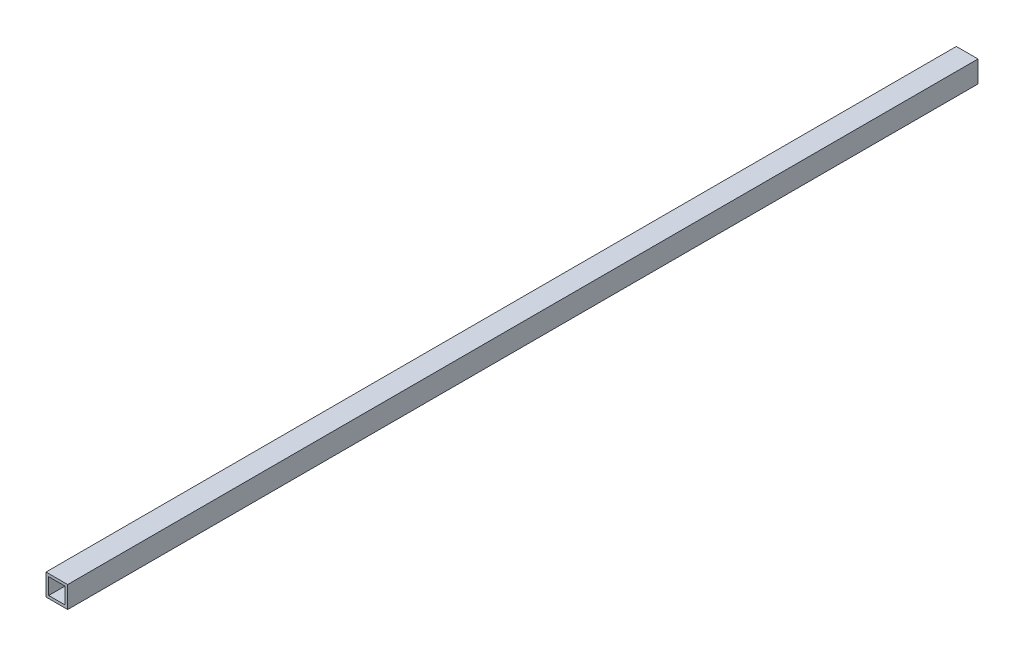
ISO-10303-21;
HEADER;
FILE_DESCRIPTION(('STEP AP214'),'2;1');
FILE_NAME('part.step','',(''),(''),'','','');
FILE_SCHEMA(('AUTOMOTIVE_DESIGN { 1 0 10303 214 1 1 1 1 }'));
ENDSEC;
DATA;
#1=APPLICATION_CONTEXT('core data for automotive mechanical design processes');
#2=APPLICATION_PROTOCOL_DEFINITION('international standard','automotive_design',2000,#1);
#3=PRODUCT_CONTEXT('',#1,'mechanical');
#4=PRODUCT('Part','Part','',(#3));
#5=PRODUCT_RELATED_PRODUCT_CATEGORY('part','',(#4));
#6=PRODUCT_DEFINITION_FORMATION('','',#4);
#7=PRODUCT_DEFINITION_CONTEXT('part definition',#1,'design');
#8=PRODUCT_DEFINITION('design','',#6,#7);
#9=PRODUCT_DEFINITION_SHAPE('','',#8);
#10=(LENGTH_UNIT() NAMED_UNIT(*) SI_UNIT(.MILLI.,.METRE.));
#11=(NAMED_UNIT(*) PLANE_ANGLE_UNIT() SI_UNIT($,.RADIAN.));
#12=(NAMED_UNIT(*) SI_UNIT($,.STERADIAN.) SOLID_ANGLE_UNIT());
#13=UNCERTAINTY_MEASURE_WITH_UNIT(LENGTH_MEASURE(1.E-05),#10,'distance_accuracy_value','');
#14=(GEOMETRIC_REPRESENTATION_CONTEXT(3) GLOBAL_UNCERTAINTY_ASSIGNED_CONTEXT((#13)) GLOBAL_UNIT_ASSIGNED_CONTEXT((#10,
#11,#12)) REPRESENTATION_CONTEXT('',''));
#15=CARTESIAN_POINT('',(0.,0.,0.));
#16=DIRECTION('',(0.,0.,1.));
#17=DIRECTION('',(1.,0.,0.));
#18=AXIS2_PLACEMENT_3D('',#15,#16,#17);
#19=CARTESIAN_POINT('',(0.,0.,533.4));
#20=DIRECTION('',(0.,0.,1.));
#21=DIRECTION('',(1.,0.,0.));
#22=AXIS2_PLACEMENT_3D('',#19,#20,#21);
#23=PLANE('',#22);
#24=DIRECTION('',(0.,-1.,0.));
#25=VECTOR('',#24,1.);
#26=CARTESIAN_POINT('',(-12.7,-12.7,533.4));
#27=LINE('',#26,#25);
#28=CARTESIAN_POINT('',(-12.7,12.7,533.4));
#29=VERTEX_POINT('',#28);
#30=CARTESIAN_POINT('',(-12.7,-12.7,533.4));
#31=VERTEX_POINT('',#30);
#32=EDGE_CURVE('E117',#29,#31,#27,.T.);
#33=ORIENTED_EDGE('',*,*,#32,.T.);
#34=DIRECTION('',(1.,0.,0.));
#35=VECTOR('',#34,1.);
#36=CARTESIAN_POINT('',(12.7,-12.7,533.4));
#37=LINE('',#36,#35);
#38=CARTESIAN_POINT('',(12.7,-12.7,533.4));
#39=VERTEX_POINT('',#38);
#40=EDGE_CURVE('E176',#31,#39,#37,.T.);
#41=ORIENTED_EDGE('',*,*,#40,.T.);
#42=DIRECTION('',(0.,1.,0.));
#43=VECTOR('',#42,1.);
#44=CARTESIAN_POINT('',(12.7,-12.7,533.4));
#45=LINE('',#44,#43);
#46=CARTESIAN_POINT('',(12.7,12.7,533.4));
#47=VERTEX_POINT('',#46);
#48=EDGE_CURVE('E179',#39,#47,#45,.T.);
#49=ORIENTED_EDGE('',*,*,#48,.T.);
#50=DIRECTION('',(-1.,0.,0.));
#51=VECTOR('',#50,1.);
#52=CARTESIAN_POINT('',(12.7,12.7,533.4));
#53=LINE('',#52,#51);
#54=EDGE_CURVE('E63',#47,#29,#53,.T.);
#55=ORIENTED_EDGE('',*,*,#54,.T.);
#56=EDGE_LOOP('',(#33,#41,#49,#55));
#57=FACE_BOUND('',#56,.T.);
#58=DIRECTION('',(1.,0.,0.));
#59=VECTOR('',#58,1.);
#60=CARTESIAN_POINT('',(9.525,-9.525,533.4));
#61=LINE('',#60,#59);
#62=CARTESIAN_POINT('',(-9.52499999999999,-9.525,533.4));
#63=VERTEX_POINT('',#62);
#64=CARTESIAN_POINT('',(9.525,-9.525,533.4));
#65=VERTEX_POINT('',#64);
#66=EDGE_CURVE('E158',#63,#65,#61,.T.);
#67=ORIENTED_EDGE('',*,*,#66,.F.);
#68=DIRECTION('',(0.,-1.,0.));
#69=VECTOR('',#68,1.);
#70=CARTESIAN_POINT('',(-9.52499999999999,-9.525,533.4));
#71=LINE('',#70,#69);
#72=CARTESIAN_POINT('',(-9.52499999999999,9.525,533.4));
#73=VERTEX_POINT('',#72);
#74=EDGE_CURVE('E113',#73,#63,#71,.T.);
#75=ORIENTED_EDGE('',*,*,#74,.F.);
#76=DIRECTION('',(-1.,0.,0.));
#77=VECTOR('',#76,1.);
#78=CARTESIAN_POINT('',(9.525,9.525,533.4));
#79=LINE('',#78,#77);
#80=CARTESIAN_POINT('',(9.525,9.525,533.4));
#81=VERTEX_POINT('',#80);
#82=EDGE_CURVE('E164',#81,#73,#79,.T.);
#83=ORIENTED_EDGE('',*,*,#82,.F.);
#84=DIRECTION('',(0.,1.,0.));
#85=VECTOR('',#84,1.);
#86=CARTESIAN_POINT('',(9.525,-9.525,533.4));
#87=LINE('',#86,#85);
#88=EDGE_CURVE('E161',#65,#81,#87,.T.);
#89=ORIENTED_EDGE('',*,*,#88,.F.);
#90=EDGE_LOOP('',(#67,#75,#83,#89));
#91=FACE_BOUND('',#90,.T.);
#92=ADVANCED_FACE('F39',(#57,#91),#23,.T.);
#93=CARTESIAN_POINT('',(-12.7,-12.7,533.4));
#94=DIRECTION('',(1.,0.,0.));
#95=DIRECTION('',(0.,0.,-1.));
#96=AXIS2_PLACEMENT_3D('',#93,#94,#95);
#97=PLANE('',#96);
#98=DIRECTION('',(0.,0.,-1.));
#99=VECTOR('',#98,1.);
#100=CARTESIAN_POINT('',(-12.7,12.7,533.4));
#101=LINE('',#100,#99);
#102=CARTESIAN_POINT('',(-12.7,12.7,-533.4));
#103=VERTEX_POINT('',#102);
#104=EDGE_CURVE('E184',#29,#103,#101,.T.);
#105=ORIENTED_EDGE('',*,*,#104,.T.);
#106=DIRECTION('',(0.,-1.,0.));
#107=VECTOR('',#106,1.);
#108=CARTESIAN_POINT('',(-12.7,-12.7,-533.4));
#109=LINE('',#108,#107);
#110=CARTESIAN_POINT('',(-12.7,-12.7,-533.4));
#111=VERTEX_POINT('',#110);
#112=EDGE_CURVE('E140',#103,#111,#109,.T.);
#113=ORIENTED_EDGE('',*,*,#112,.T.);
#114=DIRECTION('',(0.,0.,-1.));
#115=VECTOR('',#114,1.);
#116=CARTESIAN_POINT('',(-12.7,-12.7,533.4));
#117=LINE('',#116,#115);
#118=EDGE_CURVE('E11',#31,#111,#117,.T.);
#119=ORIENTED_EDGE('',*,*,#118,.F.);
#120=ORIENTED_EDGE('',*,*,#32,.F.);
#121=EDGE_LOOP('',(#105,#113,#119,#120));
#122=FACE_BOUND('',#121,.T.);
#123=ADVANCED_FACE('F41',(#122),#97,.F.);
#124=CARTESIAN_POINT('',(12.7,-12.7,533.4));
#125=DIRECTION('',(0.,1.,0.));
#126=DIRECTION('',(0.,0.,1.));
#127=AXIS2_PLACEMENT_3D('',#124,#125,#126);
#128=PLANE('',#127);
#129=ORIENTED_EDGE('',*,*,#118,.T.);
#130=DIRECTION('',(1.,0.,0.));
#131=VECTOR('',#130,1.);
#132=CARTESIAN_POINT('',(12.7,-12.7,-533.4));
#133=LINE('',#132,#131);
#134=CARTESIAN_POINT('',(12.7,-12.7,-533.4));
#135=VERTEX_POINT('',#134);
#136=EDGE_CURVE('E144',#111,#135,#133,.T.);
#137=ORIENTED_EDGE('',*,*,#136,.T.);
#138=DIRECTION('',(0.,0.,-1.));
#139=VECTOR('',#138,1.);
#140=CARTESIAN_POINT('',(12.7,-12.7,533.4));
#141=LINE('',#140,#139);
#142=EDGE_CURVE('E48',#39,#135,#141,.T.);
#143=ORIENTED_EDGE('',*,*,#142,.F.);
#144=ORIENTED_EDGE('',*,*,#40,.F.);
#145=EDGE_LOOP('',(#129,#137,#143,#144));
#146=FACE_BOUND('',#145,.T.);
#147=ADVANCED_FACE('F200',(#146),#128,.F.);
#148=CARTESIAN_POINT('',(12.7,-12.7,533.4));
#149=DIRECTION('',(-1.,0.,0.));
#150=DIRECTION('',(0.,0.,1.));
#151=AXIS2_PLACEMENT_3D('',#148,#149,#150);
#152=PLANE('',#151);
#153=ORIENTED_EDGE('',*,*,#142,.T.);
#154=DIRECTION('',(0.,1.,0.));
#155=VECTOR('',#154,1.);
#156=CARTESIAN_POINT('',(12.7,-12.7,-533.4));
#157=LINE('',#156,#155);
#158=CARTESIAN_POINT('',(12.7,12.7,-533.4));
#159=VERTEX_POINT('',#158);
#160=EDGE_CURVE('E148',#135,#159,#157,.T.);
#161=ORIENTED_EDGE('',*,*,#160,.T.);
#162=DIRECTION('',(0.,0.,-1.));
#163=VECTOR('',#162,1.);
#164=CARTESIAN_POINT('',(12.7,12.7,533.4));
#165=LINE('',#164,#163);
#166=EDGE_CURVE('E187',#47,#159,#165,.T.);
#167=ORIENTED_EDGE('',*,*,#166,.F.);
#168=ORIENTED_EDGE('',*,*,#48,.F.);
#169=EDGE_LOOP('',(#153,#161,#167,#168));
#170=FACE_BOUND('',#169,.T.);
#171=ADVANCED_FACE('F194',(#170),#152,.F.);
#172=CARTESIAN_POINT('',(12.7,12.7,533.4));
#173=DIRECTION('',(0.,-1.,0.));
#174=DIRECTION('',(0.,0.,-1.));
#175=AXIS2_PLACEMENT_3D('',#172,#173,#174);
#176=PLANE('',#175);
#177=ORIENTED_EDGE('',*,*,#166,.T.);
#178=DIRECTION('',(-1.,0.,0.));
#179=VECTOR('',#178,1.);
#180=CARTESIAN_POINT('',(12.7,12.7,-533.4));
#181=LINE('',#180,#179);
#182=EDGE_CURVE('E152',#159,#103,#181,.T.);
#183=ORIENTED_EDGE('',*,*,#182,.T.);
#184=ORIENTED_EDGE('',*,*,#104,.F.);
#185=ORIENTED_EDGE('',*,*,#54,.F.);
#186=EDGE_LOOP('',(#177,#183,#184,#185));
#187=FACE_BOUND('',#186,.T.);
#188=ADVANCED_FACE('F205',(#187),#176,.F.);
#189=CARTESIAN_POINT('',(-9.52499999999999,-9.525,533.4));
#190=DIRECTION('',(1.,0.,0.));
#191=DIRECTION('',(0.,0.,-1.));
#192=AXIS2_PLACEMENT_3D('',#189,#190,#191);
#193=PLANE('',#192);
#194=DIRECTION('',(0.,0.,-1.));
#195=VECTOR('',#194,1.);
#196=CARTESIAN_POINT('',(-9.52499999999999,-9.525,533.4));
#197=LINE('',#196,#195);
#198=CARTESIAN_POINT('',(-9.52499999999999,-9.525,-533.4));
#199=VERTEX_POINT('',#198);
#200=EDGE_CURVE('E105',#63,#199,#197,.T.);
#201=ORIENTED_EDGE('',*,*,#200,.T.);
#202=DIRECTION('',(0.,-1.,0.));
#203=VECTOR('',#202,1.);
#204=CARTESIAN_POINT('',(-9.52499999999999,-9.525,-533.4));
#205=LINE('',#204,#203);
#206=CARTESIAN_POINT('',(-9.52499999999999,9.525,-533.4));
#207=VERTEX_POINT('',#206);
#208=EDGE_CURVE('E110',#207,#199,#205,.T.);
#209=ORIENTED_EDGE('',*,*,#208,.F.);
#210=DIRECTION('',(0.,0.,-1.));
#211=VECTOR('',#210,1.);
#212=CARTESIAN_POINT('',(-9.52499999999999,9.525,533.4));
#213=LINE('',#212,#211);
#214=EDGE_CURVE('E167',#73,#207,#213,.T.);
#215=ORIENTED_EDGE('',*,*,#214,.F.);
#216=ORIENTED_EDGE('',*,*,#74,.T.);
#217=EDGE_LOOP('',(#201,#209,#215,#216));
#218=FACE_BOUND('',#217,.T.);
#219=ADVANCED_FACE('F107',(#218),#193,.T.);
#220=CARTESIAN_POINT('',(9.525,-9.525,533.4));
#221=DIRECTION('',(0.,1.,0.));
#222=DIRECTION('',(0.,0.,1.));
#223=AXIS2_PLACEMENT_3D('',#220,#221,#222);
#224=PLANE('',#223);
#225=DIRECTION('',(0.,0.,-1.));
#226=VECTOR('',#225,1.);
#227=CARTESIAN_POINT('',(9.525,-9.525,533.4));
#228=LINE('',#227,#226);
#229=CARTESIAN_POINT('',(9.525,-9.525,-533.4));
#230=VERTEX_POINT('',#229);
#231=EDGE_CURVE('E118',#65,#230,#228,.T.);
#232=ORIENTED_EDGE('',*,*,#231,.T.);
#233=DIRECTION('',(1.,0.,0.));
#234=VECTOR('',#233,1.);
#235=CARTESIAN_POINT('',(9.525,-9.525,-533.4));
#236=LINE('',#235,#234);
#237=EDGE_CURVE('E121',#199,#230,#236,.T.);
#238=ORIENTED_EDGE('',*,*,#237,.F.);
#239=ORIENTED_EDGE('',*,*,#200,.F.);
#240=ORIENTED_EDGE('',*,*,#66,.T.);
#241=EDGE_LOOP('',(#232,#238,#239,#240));
#242=FACE_BOUND('',#241,.T.);
#243=ADVANCED_FACE('F122',(#242),#224,.T.);
#244=CARTESIAN_POINT('',(9.525,-9.525,533.4));
#245=DIRECTION('',(-1.,0.,0.));
#246=DIRECTION('',(0.,0.,1.));
#247=AXIS2_PLACEMENT_3D('',#244,#245,#246);
#248=PLANE('',#247);
#249=DIRECTION('',(0.,0.,-1.));
#250=VECTOR('',#249,1.);
#251=CARTESIAN_POINT('',(9.525,9.525,533.4));
#252=LINE('',#251,#250);
#253=CARTESIAN_POINT('',(9.525,9.525,-533.4));
#254=VERTEX_POINT('',#253);
#255=EDGE_CURVE('E55',#81,#254,#252,.T.);
#256=ORIENTED_EDGE('',*,*,#255,.T.);
#257=DIRECTION('',(0.,1.,0.));
#258=VECTOR('',#257,1.);
#259=CARTESIAN_POINT('',(9.525,-9.525,-533.4));
#260=LINE('',#259,#258);
#261=EDGE_CURVE('E128',#230,#254,#260,.T.);
#262=ORIENTED_EDGE('',*,*,#261,.F.);
#263=ORIENTED_EDGE('',*,*,#231,.F.);
#264=ORIENTED_EDGE('',*,*,#88,.T.);
#265=EDGE_LOOP('',(#256,#262,#263,#264));
#266=FACE_BOUND('',#265,.T.);
#267=ADVANCED_FACE('F223',(#266),#248,.T.);
#268=CARTESIAN_POINT('',(9.525,9.525,533.4));
#269=DIRECTION('',(0.,-1.,0.));
#270=DIRECTION('',(0.,0.,-1.));
#271=AXIS2_PLACEMENT_3D('',#268,#269,#270);
#272=PLANE('',#271);
#273=ORIENTED_EDGE('',*,*,#214,.T.);
#274=DIRECTION('',(-1.,0.,0.));
#275=VECTOR('',#274,1.);
#276=CARTESIAN_POINT('',(9.525,9.525,-533.4));
#277=LINE('',#276,#275);
#278=EDGE_CURVE('E132',#254,#207,#277,.T.);
#279=ORIENTED_EDGE('',*,*,#278,.F.);
#280=ORIENTED_EDGE('',*,*,#255,.F.);
#281=ORIENTED_EDGE('',*,*,#82,.T.);
#282=EDGE_LOOP('',(#273,#279,#280,#281));
#283=FACE_BOUND('',#282,.T.);
#284=ADVANCED_FACE('F226',(#283),#272,.T.);
#285=CARTESIAN_POINT('',(0.,0.,-533.4));
#286=DIRECTION('',(0.,0.,1.));
#287=DIRECTION('',(1.,0.,0.));
#288=AXIS2_PLACEMENT_3D('',#285,#286,#287);
#289=PLANE('',#288);
#290=ORIENTED_EDGE('',*,*,#278,.T.);
#291=ORIENTED_EDGE('',*,*,#208,.T.);
#292=ORIENTED_EDGE('',*,*,#237,.T.);
#293=ORIENTED_EDGE('',*,*,#261,.T.);
#294=EDGE_LOOP('',(#290,#291,#292,#293));
#295=FACE_BOUND('',#294,.T.);
#296=ORIENTED_EDGE('',*,*,#112,.F.);
#297=ORIENTED_EDGE('',*,*,#182,.F.);
#298=ORIENTED_EDGE('',*,*,#160,.F.);
#299=ORIENTED_EDGE('',*,*,#136,.F.);
#300=EDGE_LOOP('',(#296,#297,#298,#299));
#301=FACE_BOUND('',#300,.T.);
#302=ADVANCED_FACE('F130',(#295,#301),#289,.F.);
#303=CLOSED_SHELL('',(#92,#123,#147,#171,#188,#219,#243,#267,#284,#302));
#304=MANIFOLD_SOLID_BREP('B2',#303);
#305=ADVANCED_BREP_SHAPE_REPRESENTATION('',(#18,#304),#14);
#306=SHAPE_DEFINITION_REPRESENTATION(#9,#305);
ENDSEC;
END-ISO-10303-21;
